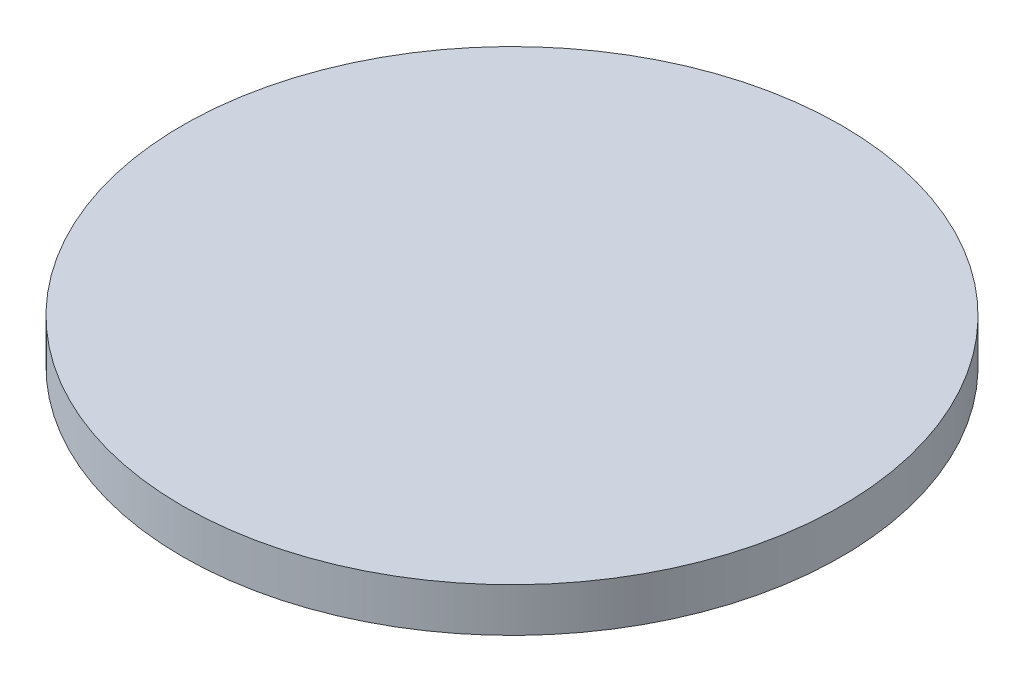
ISO-10303-21;
HEADER;
FILE_DESCRIPTION(('STEP AP214'),'2;1');
FILE_NAME('part.step','',(''),(''),'','','');
FILE_SCHEMA(('AUTOMOTIVE_DESIGN { 1 0 10303 214 1 1 1 1 }'));
ENDSEC;
DATA;
#1=APPLICATION_CONTEXT('core data for automotive mechanical design processes');
#2=APPLICATION_PROTOCOL_DEFINITION('international standard','automotive_design',2000,#1);
#3=PRODUCT_CONTEXT('',#1,'mechanical');
#4=PRODUCT('Part','Part','',(#3));
#5=PRODUCT_RELATED_PRODUCT_CATEGORY('part','',(#4));
#6=PRODUCT_DEFINITION_FORMATION('','',#4);
#7=PRODUCT_DEFINITION_CONTEXT('part definition',#1,'design');
#8=PRODUCT_DEFINITION('design','',#6,#7);
#9=PRODUCT_DEFINITION_SHAPE('','',#8);
#10=(LENGTH_UNIT() NAMED_UNIT(*) SI_UNIT(.MILLI.,.METRE.));
#11=(NAMED_UNIT(*) PLANE_ANGLE_UNIT() SI_UNIT($,.RADIAN.));
#12=(NAMED_UNIT(*) SI_UNIT($,.STERADIAN.) SOLID_ANGLE_UNIT());
#13=UNCERTAINTY_MEASURE_WITH_UNIT(LENGTH_MEASURE(1.E-05),#10,'distance_accuracy_value','');
#14=(GEOMETRIC_REPRESENTATION_CONTEXT(3) GLOBAL_UNCERTAINTY_ASSIGNED_CONTEXT((#13)) GLOBAL_UNIT_ASSIGNED_CONTEXT((#10,
#11,#12)) REPRESENTATION_CONTEXT('',''));
#15=CARTESIAN_POINT('',(0.,0.,0.));
#16=DIRECTION('',(0.,0.,1.));
#17=DIRECTION('',(1.,0.,0.));
#18=AXIS2_PLACEMENT_3D('',#15,#16,#17);
#19=CARTESIAN_POINT('',(0.,2.,0.));
#20=DIRECTION('',(0.,-1.,0.));
#21=DIRECTION('',(0.,0.,-1.));
#22=AXIS2_PLACEMENT_3D('',#19,#20,#21);
#23=CYLINDRICAL_SURFACE('',#22,15.);
#24=CARTESIAN_POINT('',(0.,2.,0.));
#25=DIRECTION('',(0.,1.,0.));
#26=DIRECTION('',(0.,0.,1.));
#27=AXIS2_PLACEMENT_3D('',#24,#25,#26);
#28=CIRCLE('',#27,15.);
#29=CARTESIAN_POINT('',(0.,2.,15.));
#30=VERTEX_POINT('',#29);
#31=EDGE_CURVE('E10',#30,#30,#28,.T.);
#32=ORIENTED_EDGE('',*,*,#31,.F.);
#33=EDGE_LOOP('',(#32));
#34=FACE_BOUND('',#33,.T.);
#35=CARTESIAN_POINT('',(0.,0.,0.));
#36=DIRECTION('',(0.,1.,0.));
#37=DIRECTION('',(0.,0.,1.));
#38=AXIS2_PLACEMENT_3D('',#35,#36,#37);
#39=CIRCLE('',#38,15.);
#40=CARTESIAN_POINT('',(0.,0.,15.));
#41=VERTEX_POINT('',#40);
#42=EDGE_CURVE('E42',#41,#41,#39,.T.);
#43=ORIENTED_EDGE('',*,*,#42,.T.);
#44=EDGE_LOOP('',(#43));
#45=FACE_BOUND('',#44,.T.);
#46=ADVANCED_FACE('F39',(#34,#45),#23,.T.);
#47=CARTESIAN_POINT('',(0.,2.,0.));
#48=DIRECTION('',(0.,1.,0.));
#49=DIRECTION('',(0.,0.,1.));
#50=AXIS2_PLACEMENT_3D('',#47,#48,#49);
#51=PLANE('',#50);
#52=ORIENTED_EDGE('',*,*,#31,.T.);
#53=EDGE_LOOP('',(#52));
#54=FACE_BOUND('',#53,.T.);
#55=ADVANCED_FACE('F54',(#54),#51,.T.);
#56=CARTESIAN_POINT('',(0.,0.,0.));
#57=DIRECTION('',(0.,1.,0.));
#58=DIRECTION('',(0.,0.,1.));
#59=AXIS2_PLACEMENT_3D('',#56,#57,#58);
#60=PLANE('',#59);
#61=ORIENTED_EDGE('',*,*,#42,.F.);
#62=EDGE_LOOP('',(#61));
#63=FACE_BOUND('',#62,.T.);
#64=ADVANCED_FACE('F52',(#63),#60,.F.);
#65=CLOSED_SHELL('',(#46,#55,#64));
#66=MANIFOLD_SOLID_BREP('B2',#65);
#67=ADVANCED_BREP_SHAPE_REPRESENTATION('',(#18,#66),#14);
#68=SHAPE_DEFINITION_REPRESENTATION(#9,#67);
ENDSEC;
END-ISO-10303-21;
